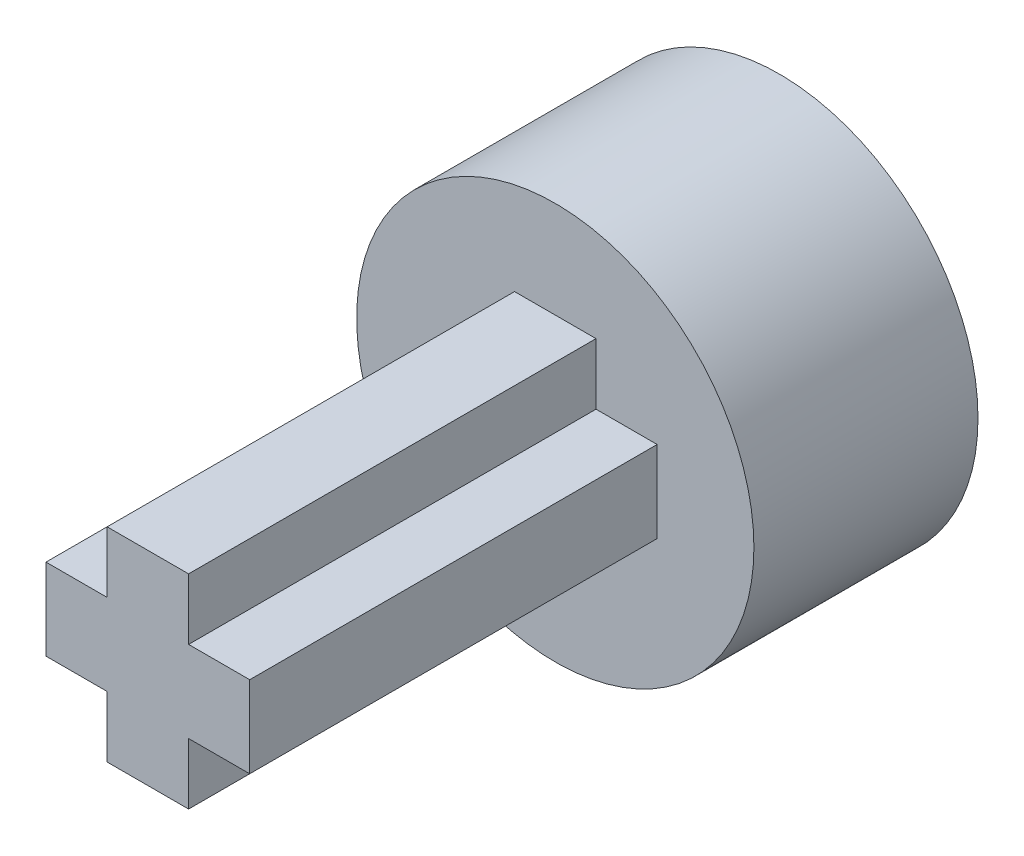
ISO-10303-21;
HEADER;
FILE_DESCRIPTION(('STEP AP214'),'2;1');
FILE_NAME('part.step','',(''),(''),'','','');
FILE_SCHEMA(('AUTOMOTIVE_DESIGN { 1 0 10303 214 1 1 1 1 }'));
ENDSEC;
DATA;
#1=APPLICATION_CONTEXT('core data for automotive mechanical design processes');
#2=APPLICATION_PROTOCOL_DEFINITION('international standard','automotive_design',2000,#1);
#3=PRODUCT_CONTEXT('',#1,'mechanical');
#4=PRODUCT('Part','Part','',(#3));
#5=PRODUCT_RELATED_PRODUCT_CATEGORY('part','',(#4));
#6=PRODUCT_DEFINITION_FORMATION('','',#4);
#7=PRODUCT_DEFINITION_CONTEXT('part definition',#1,'design');
#8=PRODUCT_DEFINITION('design','',#6,#7);
#9=PRODUCT_DEFINITION_SHAPE('','',#8);
#10=(LENGTH_UNIT() NAMED_UNIT(*) SI_UNIT(.MILLI.,.METRE.));
#11=(NAMED_UNIT(*) PLANE_ANGLE_UNIT() SI_UNIT($,.RADIAN.));
#12=(NAMED_UNIT(*) SI_UNIT($,.STERADIAN.) SOLID_ANGLE_UNIT());
#13=UNCERTAINTY_MEASURE_WITH_UNIT(LENGTH_MEASURE(1.E-05),#10,'distance_accuracy_value','');
#14=(GEOMETRIC_REPRESENTATION_CONTEXT(3) GLOBAL_UNCERTAINTY_ASSIGNED_CONTEXT((#13)) GLOBAL_UNIT_ASSIGNED_CONTEXT((#10,
#11,#12)) REPRESENTATION_CONTEXT('',''));
#15=CARTESIAN_POINT('',(0.,0.,0.));
#16=DIRECTION('',(0.,0.,1.));
#17=DIRECTION('',(1.,0.,0.));
#18=AXIS2_PLACEMENT_3D('',#15,#16,#17);
#19=CARTESIAN_POINT('',(0.,0.,5.5));
#20=DIRECTION('',(0.,0.,1.));
#21=DIRECTION('',(1.,0.,0.));
#22=AXIS2_PLACEMENT_3D('',#19,#20,#21);
#23=PLANE('',#22);
#24=CARTESIAN_POINT('',(0.,0.,5.5));
#25=DIRECTION('',(0.,0.,1.));
#26=DIRECTION('',(1.,0.,0.));
#27=AXIS2_PLACEMENT_3D('',#24,#25,#26);
#28=CIRCLE('',#27,4.875);
#29=CARTESIAN_POINT('',(4.875,0.,5.5));
#30=VERTEX_POINT('',#29);
#31=EDGE_CURVE('E203',#30,#30,#28,.T.);
#32=ORIENTED_EDGE('',*,*,#31,.T.);
#33=EDGE_LOOP('',(#32));
#34=FACE_BOUND('',#33,.T.);
#35=DIRECTION('',(-1.,0.,0.));
#36=VECTOR('',#35,1.);
#37=CARTESIAN_POINT('',(-1.,1.,5.5));
#38=LINE('',#37,#36);
#39=CARTESIAN_POINT('',(-1.,1.,5.5));
#40=VERTEX_POINT('',#39);
#41=CARTESIAN_POINT('',(-2.5,1.,5.5));
#42=VERTEX_POINT('',#41);
#43=EDGE_CURVE('E156',#40,#42,#38,.T.);
#44=ORIENTED_EDGE('',*,*,#43,.F.);
#45=DIRECTION('',(0.,-1.,0.));
#46=VECTOR('',#45,1.);
#47=CARTESIAN_POINT('',(-1.,2.5,5.5));
#48=LINE('',#47,#46);
#49=CARTESIAN_POINT('',(-1.,2.5,5.5));
#50=VERTEX_POINT('',#49);
#51=EDGE_CURVE('E153',#50,#40,#48,.T.);
#52=ORIENTED_EDGE('',*,*,#51,.F.);
#53=DIRECTION('',(-1.,0.,0.));
#54=VECTOR('',#53,1.);
#55=CARTESIAN_POINT('',(-1.,2.5,5.5));
#56=LINE('',#55,#54);
#57=CARTESIAN_POINT('',(1.,2.5,5.5));
#58=VERTEX_POINT('',#57);
#59=EDGE_CURVE('E94',#58,#50,#56,.T.);
#60=ORIENTED_EDGE('',*,*,#59,.F.);
#61=DIRECTION('',(0.,1.,0.));
#62=VECTOR('',#61,1.);
#63=CARTESIAN_POINT('',(1.,2.5,5.5));
#64=LINE('',#63,#62);
#65=CARTESIAN_POINT('',(1.,1.,5.5));
#66=VERTEX_POINT('',#65);
#67=EDGE_CURVE('E173',#66,#58,#64,.T.);
#68=ORIENTED_EDGE('',*,*,#67,.F.);
#69=DIRECTION('',(-1.,0.,0.));
#70=VECTOR('',#69,1.);
#71=CARTESIAN_POINT('',(2.5,1.,5.5));
#72=LINE('',#71,#70);
#73=CARTESIAN_POINT('',(2.5,1.,5.5));
#74=VERTEX_POINT('',#73);
#75=EDGE_CURVE('E142',#74,#66,#72,.T.);
#76=ORIENTED_EDGE('',*,*,#75,.F.);
#77=DIRECTION('',(0.,1.,0.));
#78=VECTOR('',#77,1.);
#79=CARTESIAN_POINT('',(2.5,-1.,5.5));
#80=LINE('',#79,#78);
#81=CARTESIAN_POINT('',(2.5,-1.,5.5));
#82=VERTEX_POINT('',#81);
#83=EDGE_CURVE('E170',#82,#74,#80,.T.);
#84=ORIENTED_EDGE('',*,*,#83,.F.);
#85=DIRECTION('',(1.,0.,0.));
#86=VECTOR('',#85,1.);
#87=CARTESIAN_POINT('',(2.5,-1.,5.5));
#88=LINE('',#87,#86);
#89=CARTESIAN_POINT('',(1.,-1.,5.5));
#90=VERTEX_POINT('',#89);
#91=EDGE_CURVE('E168',#90,#82,#88,.T.);
#92=ORIENTED_EDGE('',*,*,#91,.F.);
#93=DIRECTION('',(0.,1.,0.));
#94=VECTOR('',#93,1.);
#95=CARTESIAN_POINT('',(1.,-1.,5.5));
#96=LINE('',#95,#94);
#97=CARTESIAN_POINT('',(1.,-2.5,5.5));
#98=VERTEX_POINT('',#97);
#99=EDGE_CURVE('E166',#98,#90,#96,.T.);
#100=ORIENTED_EDGE('',*,*,#99,.F.);
#101=DIRECTION('',(1.,0.,0.));
#102=VECTOR('',#101,1.);
#103=CARTESIAN_POINT('',(-1.,-2.5,5.5));
#104=LINE('',#103,#102);
#105=CARTESIAN_POINT('',(-1.,-2.5,5.5));
#106=VERTEX_POINT('',#105);
#107=EDGE_CURVE('E164',#106,#98,#104,.T.);
#108=ORIENTED_EDGE('',*,*,#107,.F.);
#109=DIRECTION('',(0.,-1.,0.));
#110=VECTOR('',#109,1.);
#111=CARTESIAN_POINT('',(-1.,-1.,5.5));
#112=LINE('',#111,#110);
#113=CARTESIAN_POINT('',(-1.,-1.,5.5));
#114=VERTEX_POINT('',#113);
#115=EDGE_CURVE('E162',#114,#106,#112,.T.);
#116=ORIENTED_EDGE('',*,*,#115,.F.);
#117=DIRECTION('',(1.,0.,0.));
#118=VECTOR('',#117,1.);
#119=CARTESIAN_POINT('',(-1.,-1.,5.5));
#120=LINE('',#119,#118);
#121=CARTESIAN_POINT('',(-2.5,-1.,5.5));
#122=VERTEX_POINT('',#121);
#123=EDGE_CURVE('E160',#122,#114,#120,.T.);
#124=ORIENTED_EDGE('',*,*,#123,.F.);
#125=DIRECTION('',(0.,-1.,0.));
#126=VECTOR('',#125,1.);
#127=CARTESIAN_POINT('',(-2.5,-1.,5.5));
#128=LINE('',#127,#126);
#129=EDGE_CURVE('E158',#42,#122,#128,.T.);
#130=ORIENTED_EDGE('',*,*,#129,.F.);
#131=EDGE_LOOP('',(#44,#52,#60,#68,#76,#84,#92,#100,#108,#116,#124,#130));
#132=FACE_BOUND('',#131,.T.);
#133=ADVANCED_FACE('F33',(#34,#132),#23,.T.);
#134=CARTESIAN_POINT('',(0.,0.,0.));
#135=DIRECTION('',(0.,0.,1.));
#136=DIRECTION('',(1.,0.,0.));
#137=AXIS2_PLACEMENT_3D('',#134,#135,#136);
#138=PLANE('',#137);
#139=CARTESIAN_POINT('',(0.,0.,0.));
#140=DIRECTION('',(0.,0.,1.));
#141=DIRECTION('',(1.,0.,0.));
#142=AXIS2_PLACEMENT_3D('',#139,#140,#141);
#143=CIRCLE('',#142,3.375);
#144=CARTESIAN_POINT('',(3.375,0.,0.));
#145=VERTEX_POINT('',#144);
#146=EDGE_CURVE('E41',#145,#145,#143,.T.);
#147=ORIENTED_EDGE('',*,*,#146,.T.);
#148=EDGE_LOOP('',(#147));
#149=FACE_BOUND('',#148,.T.);
#150=CARTESIAN_POINT('',(0.,0.,0.));
#151=DIRECTION('',(0.,0.,1.));
#152=DIRECTION('',(1.,0.,0.));
#153=AXIS2_PLACEMENT_3D('',#150,#151,#152);
#154=CIRCLE('',#153,4.875);
#155=CARTESIAN_POINT('',(4.875,0.,0.));
#156=VERTEX_POINT('',#155);
#157=EDGE_CURVE('E209',#156,#156,#154,.T.);
#158=ORIENTED_EDGE('',*,*,#157,.F.);
#159=EDGE_LOOP('',(#158));
#160=FACE_BOUND('',#159,.T.);
#161=ADVANCED_FACE('F214',(#149,#160),#138,.F.);
#162=CARTESIAN_POINT('',(0.,0.,3.5));
#163=DIRECTION('',(0.,0.,-1.));
#164=DIRECTION('',(-1.,0.,0.));
#165=AXIS2_PLACEMENT_3D('',#162,#163,#164);
#166=CYLINDRICAL_SURFACE('',#165,4.875);
#167=ORIENTED_EDGE('',*,*,#157,.T.);
#168=EDGE_LOOP('',(#167));
#169=FACE_BOUND('',#168,.T.);
#170=ORIENTED_EDGE('',*,*,#31,.F.);
#171=EDGE_LOOP('',(#170));
#172=FACE_BOUND('',#171,.T.);
#173=ADVANCED_FACE('F238',(#169,#172),#166,.T.);
#174=CARTESIAN_POINT('',(0.,0.,3.5));
#175=DIRECTION('',(0.,0.,-1.));
#176=DIRECTION('',(-1.,0.,0.));
#177=AXIS2_PLACEMENT_3D('',#174,#175,#176);
#178=CYLINDRICAL_SURFACE('',#177,2.875);
#179=CARTESIAN_POINT('',(0.,0.,0.500000000000004));
#180=DIRECTION('',(0.,0.,1.));
#181=DIRECTION('',(1.,0.,0.));
#182=AXIS2_PLACEMENT_3D('',#179,#180,#181);
#183=CIRCLE('',#182,2.875);
#184=CARTESIAN_POINT('',(2.875,0.,0.500000000000004));
#185=VERTEX_POINT('',#184);
#186=EDGE_CURVE('E11',#185,#185,#183,.F.);
#187=ORIENTED_EDGE('',*,*,#186,.T.);
#188=EDGE_LOOP('',(#187));
#189=FACE_BOUND('',#188,.T.);
#190=CARTESIAN_POINT('',(0.,0.,3.5));
#191=DIRECTION('',(0.,0.,1.));
#192=DIRECTION('',(1.,0.,0.));
#193=AXIS2_PLACEMENT_3D('',#190,#191,#192);
#194=CIRCLE('',#193,2.875);
#195=CARTESIAN_POINT('',(2.875,0.,3.5));
#196=VERTEX_POINT('',#195);
#197=EDGE_CURVE('E206',#196,#196,#194,.T.);
#198=ORIENTED_EDGE('',*,*,#197,.T.);
#199=EDGE_LOOP('',(#198));
#200=FACE_BOUND('',#199,.T.);
#201=ADVANCED_FACE('F228',(#189,#200),#178,.F.);
#202=CARTESIAN_POINT('',(0.,0.,3.5));
#203=DIRECTION('',(0.,0.,1.));
#204=DIRECTION('',(1.,0.,0.));
#205=AXIS2_PLACEMENT_3D('',#202,#203,#204);
#206=PLANE('',#205);
#207=ORIENTED_EDGE('',*,*,#197,.F.);
#208=EDGE_LOOP('',(#207));
#209=FACE_BOUND('',#208,.T.);
#210=ADVANCED_FACE('F219',(#209),#206,.F.);
#211=CARTESIAN_POINT('',(0.,0.,0.));
#212=DIRECTION('',(0.,0.,-1.));
#213=DIRECTION('',(-1.,0.,0.));
#214=AXIS2_PLACEMENT_3D('',#211,#212,#213);
#215=CONICAL_SURFACE('',#214,3.375,0.785398163397446);
#216=ORIENTED_EDGE('',*,*,#186,.F.);
#217=EDGE_LOOP('',(#216));
#218=FACE_BOUND('',#217,.T.);
#219=ORIENTED_EDGE('',*,*,#146,.F.);
#220=EDGE_LOOP('',(#219));
#221=FACE_BOUND('',#220,.T.);
#222=ADVANCED_FACE('F35',(#218,#221),#215,.F.);
#223=CARTESIAN_POINT('',(-1.,2.5,15.5));
#224=DIRECTION('',(1.,0.,0.));
#225=DIRECTION('',(0.,0.,-1.));
#226=AXIS2_PLACEMENT_3D('',#223,#224,#225);
#227=PLANE('',#226);
#228=ORIENTED_EDGE('',*,*,#51,.T.);
#229=DIRECTION('',(0.,0.,-1.));
#230=VECTOR('',#229,1.);
#231=CARTESIAN_POINT('',(-1.,1.,15.5));
#232=LINE('',#231,#230);
#233=CARTESIAN_POINT('',(-1.,1.,15.5));
#234=VERTEX_POINT('',#233);
#235=EDGE_CURVE('E201',#234,#40,#232,.T.);
#236=ORIENTED_EDGE('',*,*,#235,.F.);
#237=DIRECTION('',(0.,-1.,0.));
#238=VECTOR('',#237,1.);
#239=CARTESIAN_POINT('',(-1.,2.5,15.5));
#240=LINE('',#239,#238);
#241=CARTESIAN_POINT('',(-1.,2.5,15.5));
#242=VERTEX_POINT('',#241);
#243=EDGE_CURVE('E176',#242,#234,#240,.T.);
#244=ORIENTED_EDGE('',*,*,#243,.F.);
#245=DIRECTION('',(0.,0.,-1.));
#246=VECTOR('',#245,1.);
#247=CARTESIAN_POINT('',(-1.,2.5,15.5));
#248=LINE('',#247,#246);
#249=EDGE_CURVE('E149',#242,#50,#248,.T.);
#250=ORIENTED_EDGE('',*,*,#249,.T.);
#251=EDGE_LOOP('',(#228,#236,#244,#250));
#252=FACE_BOUND('',#251,.T.);
#253=ADVANCED_FACE('F218',(#252),#227,.F.);
#254=CARTESIAN_POINT('',(-1.,1.,15.5));
#255=DIRECTION('',(0.,-1.,0.));
#256=DIRECTION('',(1.,0.,0.));
#257=AXIS2_PLACEMENT_3D('',#254,#255,#256);
#258=PLANE('',#257);
#259=ORIENTED_EDGE('',*,*,#43,.T.);
#260=DIRECTION('',(0.,0.,-1.));
#261=VECTOR('',#260,1.);
#262=CARTESIAN_POINT('',(-2.5,1.,15.5));
#263=LINE('',#262,#261);
#264=CARTESIAN_POINT('',(-2.5,1.,15.5));
#265=VERTEX_POINT('',#264);
#266=EDGE_CURVE('E198',#265,#42,#263,.T.);
#267=ORIENTED_EDGE('',*,*,#266,.F.);
#268=DIRECTION('',(-1.,0.,0.));
#269=VECTOR('',#268,1.);
#270=CARTESIAN_POINT('',(-1.,1.,15.5));
#271=LINE('',#270,#269);
#272=EDGE_CURVE('E102',#234,#265,#271,.T.);
#273=ORIENTED_EDGE('',*,*,#272,.F.);
#274=ORIENTED_EDGE('',*,*,#235,.T.);
#275=EDGE_LOOP('',(#259,#267,#273,#274));
#276=FACE_BOUND('',#275,.T.);
#277=ADVANCED_FACE('F225',(#276),#258,.F.);
#278=CARTESIAN_POINT('',(-2.5,-1.,15.5));
#279=DIRECTION('',(1.,0.,0.));
#280=DIRECTION('',(0.,0.,-1.));
#281=AXIS2_PLACEMENT_3D('',#278,#279,#280);
#282=PLANE('',#281);
#283=ORIENTED_EDGE('',*,*,#129,.T.);
#284=DIRECTION('',(0.,0.,-1.));
#285=VECTOR('',#284,1.);
#286=CARTESIAN_POINT('',(-2.5,-1.,15.5));
#287=LINE('',#286,#285);
#288=CARTESIAN_POINT('',(-2.5,-1.,15.5));
#289=VERTEX_POINT('',#288);
#290=EDGE_CURVE('E195',#289,#122,#287,.T.);
#291=ORIENTED_EDGE('',*,*,#290,.F.);
#292=DIRECTION('',(0.,-1.,0.));
#293=VECTOR('',#292,1.);
#294=CARTESIAN_POINT('',(-2.5,-1.,15.5));
#295=LINE('',#294,#293);
#296=EDGE_CURVE('E410',#265,#289,#295,.T.);
#297=ORIENTED_EDGE('',*,*,#296,.F.);
#298=ORIENTED_EDGE('',*,*,#266,.T.);
#299=EDGE_LOOP('',(#283,#291,#297,#298));
#300=FACE_BOUND('',#299,.T.);
#301=ADVANCED_FACE('F296',(#300),#282,.F.);
#302=CARTESIAN_POINT('',(-1.,-1.,15.5));
#303=DIRECTION('',(0.,1.,0.));
#304=DIRECTION('',(-1.,0.,0.));
#305=AXIS2_PLACEMENT_3D('',#302,#303,#304);
#306=PLANE('',#305);
#307=ORIENTED_EDGE('',*,*,#123,.T.);
#308=DIRECTION('',(0.,0.,-1.));
#309=VECTOR('',#308,1.);
#310=CARTESIAN_POINT('',(-1.,-1.,15.5));
#311=LINE('',#310,#309);
#312=CARTESIAN_POINT('',(-1.,-1.,15.5));
#313=VERTEX_POINT('',#312);
#314=EDGE_CURVE('E192',#313,#114,#311,.T.);
#315=ORIENTED_EDGE('',*,*,#314,.F.);
#316=DIRECTION('',(1.,0.,0.));
#317=VECTOR('',#316,1.);
#318=CARTESIAN_POINT('',(-1.,-1.,15.5));
#319=LINE('',#318,#317);
#320=EDGE_CURVE('E414',#289,#313,#319,.T.);
#321=ORIENTED_EDGE('',*,*,#320,.F.);
#322=ORIENTED_EDGE('',*,*,#290,.T.);
#323=EDGE_LOOP('',(#307,#315,#321,#322));
#324=FACE_BOUND('',#323,.T.);
#325=ADVANCED_FACE('F303',(#324),#306,.F.);
#326=CARTESIAN_POINT('',(-1.,-1.,15.5));
#327=DIRECTION('',(1.,0.,0.));
#328=DIRECTION('',(0.,1.,0.));
#329=AXIS2_PLACEMENT_3D('',#326,#327,#328);
#330=PLANE('',#329);
#331=ORIENTED_EDGE('',*,*,#115,.T.);
#332=DIRECTION('',(0.,0.,-1.));
#333=VECTOR('',#332,1.);
#334=CARTESIAN_POINT('',(-1.,-2.5,15.5));
#335=LINE('',#334,#333);
#336=CARTESIAN_POINT('',(-1.,-2.5,15.5));
#337=VERTEX_POINT('',#336);
#338=EDGE_CURVE('E189',#337,#106,#335,.T.);
#339=ORIENTED_EDGE('',*,*,#338,.F.);
#340=DIRECTION('',(0.,-1.,0.));
#341=VECTOR('',#340,1.);
#342=CARTESIAN_POINT('',(-1.,-1.,15.5));
#343=LINE('',#342,#341);
#344=EDGE_CURVE('E416',#313,#337,#343,.T.);
#345=ORIENTED_EDGE('',*,*,#344,.F.);
#346=ORIENTED_EDGE('',*,*,#314,.T.);
#347=EDGE_LOOP('',(#331,#339,#345,#346));
#348=FACE_BOUND('',#347,.T.);
#349=ADVANCED_FACE('F312',(#348),#330,.F.);
#350=CARTESIAN_POINT('',(-1.,-2.5,15.5));
#351=DIRECTION('',(0.,1.,0.));
#352=DIRECTION('',(0.,0.,1.));
#353=AXIS2_PLACEMENT_3D('',#350,#351,#352);
#354=PLANE('',#353);
#355=ORIENTED_EDGE('',*,*,#107,.T.);
#356=DIRECTION('',(0.,0.,-1.));
#357=VECTOR('',#356,1.);
#358=CARTESIAN_POINT('',(1.,-2.5,15.5));
#359=LINE('',#358,#357);
#360=CARTESIAN_POINT('',(1.,-2.5,15.5));
#361=VERTEX_POINT('',#360);
#362=EDGE_CURVE('E186',#361,#98,#359,.T.);
#363=ORIENTED_EDGE('',*,*,#362,.F.);
#364=DIRECTION('',(1.,0.,0.));
#365=VECTOR('',#364,1.);
#366=CARTESIAN_POINT('',(-1.,-2.5,15.5));
#367=LINE('',#366,#365);
#368=EDGE_CURVE('E418',#337,#361,#367,.T.);
#369=ORIENTED_EDGE('',*,*,#368,.F.);
#370=ORIENTED_EDGE('',*,*,#338,.T.);
#371=EDGE_LOOP('',(#355,#363,#369,#370));
#372=FACE_BOUND('',#371,.T.);
#373=ADVANCED_FACE('F321',(#372),#354,.F.);
#374=CARTESIAN_POINT('',(1.,-1.,15.5));
#375=DIRECTION('',(-1.,0.,0.));
#376=DIRECTION('',(0.,-1.,0.));
#377=AXIS2_PLACEMENT_3D('',#374,#375,#376);
#378=PLANE('',#377);
#379=ORIENTED_EDGE('',*,*,#99,.T.);
#380=DIRECTION('',(0.,0.,-1.));
#381=VECTOR('',#380,1.);
#382=CARTESIAN_POINT('',(1.,-1.,15.5));
#383=LINE('',#382,#381);
#384=CARTESIAN_POINT('',(1.,-1.,15.5));
#385=VERTEX_POINT('',#384);
#386=EDGE_CURVE('E183',#385,#90,#383,.T.);
#387=ORIENTED_EDGE('',*,*,#386,.F.);
#388=DIRECTION('',(0.,1.,0.));
#389=VECTOR('',#388,1.);
#390=CARTESIAN_POINT('',(1.,-1.,15.5));
#391=LINE('',#390,#389);
#392=EDGE_CURVE('E420',#361,#385,#391,.T.);
#393=ORIENTED_EDGE('',*,*,#392,.F.);
#394=ORIENTED_EDGE('',*,*,#362,.T.);
#395=EDGE_LOOP('',(#379,#387,#393,#394));
#396=FACE_BOUND('',#395,.T.);
#397=ADVANCED_FACE('F330',(#396),#378,.F.);
#398=CARTESIAN_POINT('',(2.5,-1.,15.5));
#399=DIRECTION('',(0.,1.,0.));
#400=DIRECTION('',(0.,0.,1.));
#401=AXIS2_PLACEMENT_3D('',#398,#399,#400);
#402=PLANE('',#401);
#403=ORIENTED_EDGE('',*,*,#91,.T.);
#404=DIRECTION('',(0.,0.,-1.));
#405=VECTOR('',#404,1.);
#406=CARTESIAN_POINT('',(2.5,-1.,15.5));
#407=LINE('',#406,#405);
#408=CARTESIAN_POINT('',(2.5,-1.,15.5));
#409=VERTEX_POINT('',#408);
#410=EDGE_CURVE('E180',#409,#82,#407,.T.);
#411=ORIENTED_EDGE('',*,*,#410,.F.);
#412=DIRECTION('',(1.,0.,0.));
#413=VECTOR('',#412,1.);
#414=CARTESIAN_POINT('',(2.5,-1.,15.5));
#415=LINE('',#414,#413);
#416=EDGE_CURVE('E422',#385,#409,#415,.T.);
#417=ORIENTED_EDGE('',*,*,#416,.F.);
#418=ORIENTED_EDGE('',*,*,#386,.T.);
#419=EDGE_LOOP('',(#403,#411,#417,#418));
#420=FACE_BOUND('',#419,.T.);
#421=ADVANCED_FACE('F339',(#420),#402,.F.);
#422=CARTESIAN_POINT('',(2.5,-1.,15.5));
#423=DIRECTION('',(-1.,0.,0.));
#424=DIRECTION('',(0.,0.,1.));
#425=AXIS2_PLACEMENT_3D('',#422,#423,#424);
#426=PLANE('',#425);
#427=ORIENTED_EDGE('',*,*,#83,.T.);
#428=DIRECTION('',(0.,0.,-1.));
#429=VECTOR('',#428,1.);
#430=CARTESIAN_POINT('',(2.5,1.,15.5));
#431=LINE('',#430,#429);
#432=CARTESIAN_POINT('',(2.5,1.,15.5));
#433=VERTEX_POINT('',#432);
#434=EDGE_CURVE('E145',#433,#74,#431,.T.);
#435=ORIENTED_EDGE('',*,*,#434,.F.);
#436=DIRECTION('',(0.,1.,0.));
#437=VECTOR('',#436,1.);
#438=CARTESIAN_POINT('',(2.5,-1.,15.5));
#439=LINE('',#438,#437);
#440=EDGE_CURVE('E133',#409,#433,#439,.T.);
#441=ORIENTED_EDGE('',*,*,#440,.F.);
#442=ORIENTED_EDGE('',*,*,#410,.T.);
#443=EDGE_LOOP('',(#427,#435,#441,#442));
#444=FACE_BOUND('',#443,.T.);
#445=ADVANCED_FACE('F348',(#444),#426,.F.);
#446=CARTESIAN_POINT('',(2.5,1.,15.5));
#447=DIRECTION('',(0.,-1.,0.));
#448=DIRECTION('',(1.,0.,0.));
#449=AXIS2_PLACEMENT_3D('',#446,#447,#448);
#450=PLANE('',#449);
#451=ORIENTED_EDGE('',*,*,#75,.T.);
#452=DIRECTION('',(0.,0.,-1.));
#453=VECTOR('',#452,1.);
#454=CARTESIAN_POINT('',(1.,1.,15.5));
#455=LINE('',#454,#453);
#456=CARTESIAN_POINT('',(1.,1.,15.5));
#457=VERTEX_POINT('',#456);
#458=EDGE_CURVE('E139',#457,#66,#455,.T.);
#459=ORIENTED_EDGE('',*,*,#458,.F.);
#460=DIRECTION('',(-1.,0.,0.));
#461=VECTOR('',#460,1.);
#462=CARTESIAN_POINT('',(2.5,1.,15.5));
#463=LINE('',#462,#461);
#464=EDGE_CURVE('E127',#433,#457,#463,.T.);
#465=ORIENTED_EDGE('',*,*,#464,.F.);
#466=ORIENTED_EDGE('',*,*,#434,.T.);
#467=EDGE_LOOP('',(#451,#459,#465,#466));
#468=FACE_BOUND('',#467,.T.);
#469=ADVANCED_FACE('F140',(#468),#450,.F.);
#470=CARTESIAN_POINT('',(1.,2.5,15.5));
#471=DIRECTION('',(-1.,0.,0.));
#472=DIRECTION('',(0.,-1.,0.));
#473=AXIS2_PLACEMENT_3D('',#470,#471,#472);
#474=PLANE('',#473);
#475=ORIENTED_EDGE('',*,*,#67,.T.);
#476=DIRECTION('',(0.,0.,-1.));
#477=VECTOR('',#476,1.);
#478=CARTESIAN_POINT('',(1.,2.5,15.5));
#479=LINE('',#478,#477);
#480=CARTESIAN_POINT('',(1.,2.5,15.5));
#481=VERTEX_POINT('',#480);
#482=EDGE_CURVE('E48',#481,#58,#479,.T.);
#483=ORIENTED_EDGE('',*,*,#482,.F.);
#484=DIRECTION('',(0.,1.,0.));
#485=VECTOR('',#484,1.);
#486=CARTESIAN_POINT('',(1.,2.5,15.5));
#487=LINE('',#486,#485);
#488=EDGE_CURVE('E131',#457,#481,#487,.T.);
#489=ORIENTED_EDGE('',*,*,#488,.F.);
#490=ORIENTED_EDGE('',*,*,#458,.T.);
#491=EDGE_LOOP('',(#475,#483,#489,#490));
#492=FACE_BOUND('',#491,.T.);
#493=ADVANCED_FACE('F147',(#492),#474,.F.);
#494=CARTESIAN_POINT('',(-1.,2.5,15.5));
#495=DIRECTION('',(0.,-1.,0.));
#496=DIRECTION('',(0.,0.,-1.));
#497=AXIS2_PLACEMENT_3D('',#494,#495,#496);
#498=PLANE('',#497);
#499=ORIENTED_EDGE('',*,*,#59,.T.);
#500=ORIENTED_EDGE('',*,*,#249,.F.);
#501=DIRECTION('',(-1.,0.,0.));
#502=VECTOR('',#501,1.);
#503=CARTESIAN_POINT('',(-1.,2.5,15.5));
#504=LINE('',#503,#502);
#505=EDGE_CURVE('E56',#481,#242,#504,.T.);
#506=ORIENTED_EDGE('',*,*,#505,.F.);
#507=ORIENTED_EDGE('',*,*,#482,.T.);
#508=EDGE_LOOP('',(#499,#500,#506,#507));
#509=FACE_BOUND('',#508,.T.);
#510=ADVANCED_FACE('F372',(#509),#498,.F.);
#511=CARTESIAN_POINT('',(0.,0.,15.5));
#512=DIRECTION('',(0.,0.,-1.));
#513=DIRECTION('',(-1.,0.,0.));
#514=AXIS2_PLACEMENT_3D('',#511,#512,#513);
#515=PLANE('',#514);
#516=ORIENTED_EDGE('',*,*,#243,.T.);
#517=ORIENTED_EDGE('',*,*,#272,.T.);
#518=ORIENTED_EDGE('',*,*,#296,.T.);
#519=ORIENTED_EDGE('',*,*,#320,.T.);
#520=ORIENTED_EDGE('',*,*,#344,.T.);
#521=ORIENTED_EDGE('',*,*,#368,.T.);
#522=ORIENTED_EDGE('',*,*,#392,.T.);
#523=ORIENTED_EDGE('',*,*,#416,.T.);
#524=ORIENTED_EDGE('',*,*,#440,.T.);
#525=ORIENTED_EDGE('',*,*,#464,.T.);
#526=ORIENTED_EDGE('',*,*,#488,.T.);
#527=ORIENTED_EDGE('',*,*,#505,.T.);
#528=EDGE_LOOP('',(#516,#517,#518,#519,#520,#521,#522,#523,#524,#525,#526,#527));
#529=FACE_BOUND('',#528,.T.);
#530=ADVANCED_FACE('F129',(#529),#515,.F.);
#531=CLOSED_SHELL('',(#133,#161,#173,#201,#210,#222,#253,#277,#301,#325,#349,#373,#397,#421,
#445,#469,#493,#510,#530));
#532=MANIFOLD_SOLID_BREP('B2',#531);
#533=ADVANCED_BREP_SHAPE_REPRESENTATION('',(#18,#532),#14);
#534=SHAPE_DEFINITION_REPRESENTATION(#9,#533);
ENDSEC;
END-ISO-10303-21;
